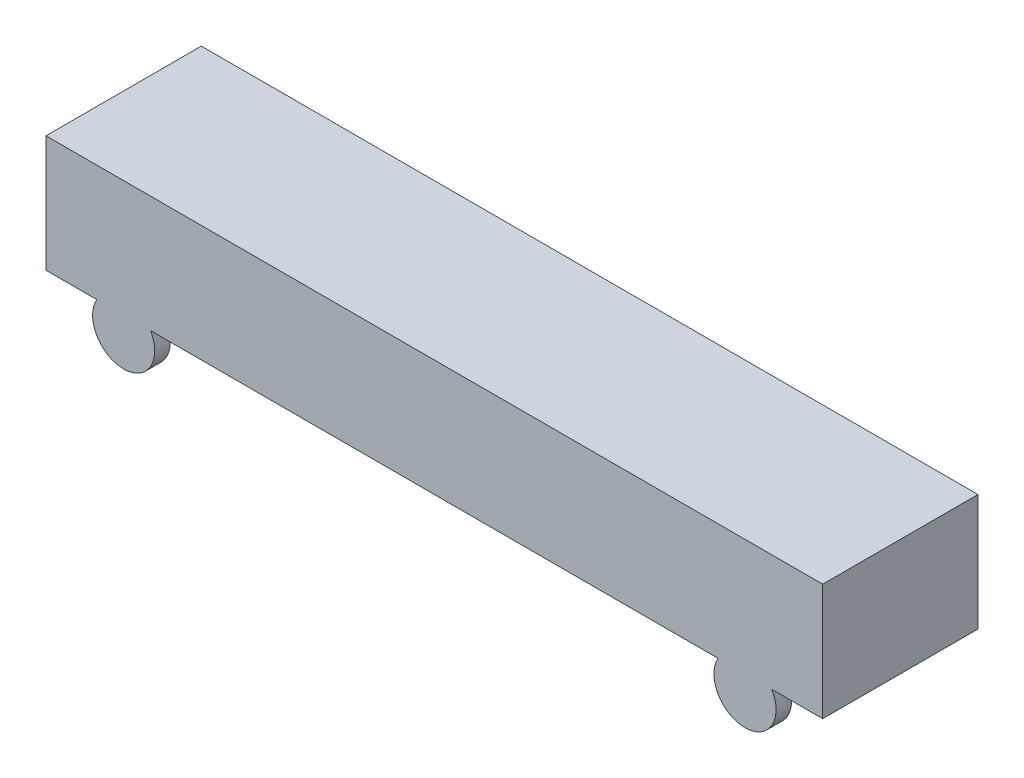
ISO-10303-21;
HEADER;
FILE_DESCRIPTION(('STEP AP214'),'2;1');
FILE_NAME('part.step','',(''),(''),'','','');
FILE_SCHEMA(('AUTOMOTIVE_DESIGN { 1 0 10303 214 1 1 1 1 }'));
ENDSEC;
DATA;
#1=APPLICATION_CONTEXT('core data for automotive mechanical design processes');
#2=APPLICATION_PROTOCOL_DEFINITION('international standard','automotive_design',2000,#1);
#3=PRODUCT_CONTEXT('',#1,'mechanical');
#4=PRODUCT('Part','Part','',(#3));
#5=PRODUCT_RELATED_PRODUCT_CATEGORY('part','',(#4));
#6=PRODUCT_DEFINITION_FORMATION('','',#4);
#7=PRODUCT_DEFINITION_CONTEXT('part definition',#1,'design');
#8=PRODUCT_DEFINITION('design','',#6,#7);
#9=PRODUCT_DEFINITION_SHAPE('','',#8);
#10=(LENGTH_UNIT() NAMED_UNIT(*) SI_UNIT(.MILLI.,.METRE.));
#11=(NAMED_UNIT(*) PLANE_ANGLE_UNIT() SI_UNIT($,.RADIAN.));
#12=(NAMED_UNIT(*) SI_UNIT($,.STERADIAN.) SOLID_ANGLE_UNIT());
#13=UNCERTAINTY_MEASURE_WITH_UNIT(LENGTH_MEASURE(1.E-05),#10,'distance_accuracy_value','');
#14=(GEOMETRIC_REPRESENTATION_CONTEXT(3) GLOBAL_UNCERTAINTY_ASSIGNED_CONTEXT((#13)) GLOBAL_UNIT_ASSIGNED_CONTEXT((#10,
#11,#12)) REPRESENTATION_CONTEXT('',''));
#15=CARTESIAN_POINT('',(0.,0.,0.));
#16=DIRECTION('',(0.,0.,1.));
#17=DIRECTION('',(1.,0.,0.));
#18=AXIS2_PLACEMENT_3D('',#15,#16,#17);
#19=CARTESIAN_POINT('',(0.,0.,-1.));
#20=DIRECTION('',(0.,-1.,0.));
#21=DIRECTION('',(0.,0.,-1.));
#22=AXIS2_PLACEMENT_3D('',#19,#20,#21);
#23=PLANE('',#22);
#24=DIRECTION('',(1.,0.,0.));
#25=VECTOR('',#24,1.);
#26=CARTESIAN_POINT('',(0.,0.,-1.));
#27=LINE('',#26,#25);
#28=CARTESIAN_POINT('',(0.,0.,-1.));
#29=VERTEX_POINT('',#28);
#30=CARTESIAN_POINT('',(0.653589838486258,0.,-1.));
#31=VERTEX_POINT('',#30);
#32=EDGE_CURVE('E135',#29,#31,#27,.T.);
#33=ORIENTED_EDGE('',*,*,#32,.T.);
#34=DIRECTION('',(0.,0.,-1.));
#35=VECTOR('',#34,1.);
#36=CARTESIAN_POINT('',(0.653589838486258,0.,-0.8));
#37=LINE('',#36,#35);
#38=CARTESIAN_POINT('',(0.653589838486258,0.,-0.8));
#39=VERTEX_POINT('',#38);
#40=EDGE_CURVE('E59',#31,#39,#37,.F.);
#41=ORIENTED_EDGE('',*,*,#40,.T.);
#42=DIRECTION('',(1.,0.,0.));
#43=VECTOR('',#42,1.);
#44=CARTESIAN_POINT('',(0.,0.,-0.8));
#45=LINE('',#44,#43);
#46=CARTESIAN_POINT('',(1.34641016151374,0.,-0.8));
#47=VERTEX_POINT('',#46);
#48=EDGE_CURVE('E11',#39,#47,#45,.T.);
#49=ORIENTED_EDGE('',*,*,#48,.T.);
#50=DIRECTION('',(0.,0.,-1.));
#51=VECTOR('',#50,1.);
#52=CARTESIAN_POINT('',(1.34641016151374,0.,-0.8));
#53=LINE('',#52,#51);
#54=CARTESIAN_POINT('',(1.34641016151374,0.,-1.));
#55=VERTEX_POINT('',#54);
#56=EDGE_CURVE('E138',#47,#55,#53,.T.);
#57=ORIENTED_EDGE('',*,*,#56,.T.);
#58=CARTESIAN_POINT('',(8.65358983848623,0.,-1.));
#59=VERTEX_POINT('',#58);
#60=EDGE_CURVE('E127',#55,#59,#27,.T.);
#61=ORIENTED_EDGE('',*,*,#60,.T.);
#62=DIRECTION('',(0.,0.,-1.));
#63=VECTOR('',#62,1.);
#64=CARTESIAN_POINT('',(8.65358983848623,0.,-0.8));
#65=LINE('',#64,#63);
#66=CARTESIAN_POINT('',(8.65358983848623,0.,-0.8));
#67=VERTEX_POINT('',#66);
#68=EDGE_CURVE('E156',#59,#67,#65,.F.);
#69=ORIENTED_EDGE('',*,*,#68,.T.);
#70=DIRECTION('',(1.,0.,0.));
#71=VECTOR('',#70,1.);
#72=CARTESIAN_POINT('',(0.,0.,-0.8));
#73=LINE('',#72,#71);
#74=CARTESIAN_POINT('',(9.34641016151378,0.,-0.8));
#75=VERTEX_POINT('',#74);
#76=EDGE_CURVE('E49',#67,#75,#73,.T.);
#77=ORIENTED_EDGE('',*,*,#76,.T.);
#78=DIRECTION('',(0.,0.,-1.));
#79=VECTOR('',#78,1.);
#80=CARTESIAN_POINT('',(9.34641016151378,0.,-0.8));
#81=LINE('',#80,#79);
#82=CARTESIAN_POINT('',(9.34641016151378,0.,-1.));
#83=VERTEX_POINT('',#82);
#84=EDGE_CURVE('E152',#75,#83,#81,.T.);
#85=ORIENTED_EDGE('',*,*,#84,.T.);
#86=CARTESIAN_POINT('',(10.,0.,-1.));
#87=VERTEX_POINT('',#86);
#88=EDGE_CURVE('E136',#83,#87,#27,.T.);
#89=ORIENTED_EDGE('',*,*,#88,.T.);
#90=DIRECTION('',(0.,0.,1.));
#91=VECTOR('',#90,1.);
#92=CARTESIAN_POINT('',(10.,0.,-1.));
#93=LINE('',#92,#91);
#94=CARTESIAN_POINT('',(10.,0.,1.));
#95=VERTEX_POINT('',#94);
#96=EDGE_CURVE('E207',#87,#95,#93,.T.);
#97=ORIENTED_EDGE('',*,*,#96,.T.);
#98=DIRECTION('',(1.,0.,0.));
#99=VECTOR('',#98,1.);
#100=CARTESIAN_POINT('',(0.,0.,1.));
#101=LINE('',#100,#99);
#102=CARTESIAN_POINT('',(9.34641016151378,0.,1.));
#103=VERTEX_POINT('',#102);
#104=EDGE_CURVE('E181',#103,#95,#101,.T.);
#105=ORIENTED_EDGE('',*,*,#104,.F.);
#106=DIRECTION('',(0.,0.,1.));
#107=VECTOR('',#106,1.);
#108=CARTESIAN_POINT('',(9.34641016151378,0.,0.8));
#109=LINE('',#108,#107);
#110=CARTESIAN_POINT('',(9.34641016151378,0.,0.8));
#111=VERTEX_POINT('',#110);
#112=EDGE_CURVE('E175',#111,#103,#109,.T.);
#113=ORIENTED_EDGE('',*,*,#112,.F.);
#114=DIRECTION('',(-1.,0.,0.));
#115=VECTOR('',#114,1.);
#116=CARTESIAN_POINT('',(0.,0.,0.8));
#117=LINE('',#116,#115);
#118=CARTESIAN_POINT('',(8.65358983848623,0.,0.8));
#119=VERTEX_POINT('',#118);
#120=EDGE_CURVE('E204',#111,#119,#117,.T.);
#121=ORIENTED_EDGE('',*,*,#120,.T.);
#122=DIRECTION('',(0.,0.,1.));
#123=VECTOR('',#122,1.);
#124=CARTESIAN_POINT('',(8.65358983848623,0.,0.8));
#125=LINE('',#124,#123);
#126=CARTESIAN_POINT('',(8.65358983848623,0.,1.));
#127=VERTEX_POINT('',#126);
#128=EDGE_CURVE('E172',#127,#119,#125,.F.);
#129=ORIENTED_EDGE('',*,*,#128,.F.);
#130=CARTESIAN_POINT('',(1.34641016151374,0.,1.));
#131=VERTEX_POINT('',#130);
#132=EDGE_CURVE('E186',#131,#127,#101,.T.);
#133=ORIENTED_EDGE('',*,*,#132,.F.);
#134=DIRECTION('',(0.,0.,1.));
#135=VECTOR('',#134,1.);
#136=CARTESIAN_POINT('',(1.34641016151374,0.,0.8));
#137=LINE('',#136,#135);
#138=CARTESIAN_POINT('',(1.34641016151374,0.,0.8));
#139=VERTEX_POINT('',#138);
#140=EDGE_CURVE('E165',#139,#131,#137,.T.);
#141=ORIENTED_EDGE('',*,*,#140,.F.);
#142=DIRECTION('',(-1.,0.,0.));
#143=VECTOR('',#142,1.);
#144=CARTESIAN_POINT('',(0.,0.,0.8));
#145=LINE('',#144,#143);
#146=CARTESIAN_POINT('',(0.653589838486258,0.,0.8));
#147=VERTEX_POINT('',#146);
#148=EDGE_CURVE('E213',#139,#147,#145,.T.);
#149=ORIENTED_EDGE('',*,*,#148,.T.);
#150=DIRECTION('',(0.,0.,1.));
#151=VECTOR('',#150,1.);
#152=CARTESIAN_POINT('',(0.653589838486258,0.,0.8));
#153=LINE('',#152,#151);
#154=CARTESIAN_POINT('',(0.653589838486258,0.,1.));
#155=VERTEX_POINT('',#154);
#156=EDGE_CURVE('E161',#155,#147,#153,.F.);
#157=ORIENTED_EDGE('',*,*,#156,.F.);
#158=CARTESIAN_POINT('',(0.,0.,1.));
#159=VERTEX_POINT('',#158);
#160=EDGE_CURVE('E182',#159,#155,#101,.T.);
#161=ORIENTED_EDGE('',*,*,#160,.F.);
#162=DIRECTION('',(0.,0.,1.));
#163=VECTOR('',#162,1.);
#164=CARTESIAN_POINT('',(0.,0.,-1.));
#165=LINE('',#164,#163);
#166=EDGE_CURVE('E201',#29,#159,#165,.T.);
#167=ORIENTED_EDGE('',*,*,#166,.F.);
#168=EDGE_LOOP('',(#33,#41,#49,#57,#61,#69,#77,#85,#89,#97,#105,#113,#121,#129,#133,#141,#149,
#157,#161,#167));
#169=FACE_BOUND('',#168,.T.);
#170=ADVANCED_FACE('F41',(#169),#23,.T.);
#171=CARTESIAN_POINT('',(0.,0.,-1.));
#172=DIRECTION('',(-1.,0.,0.));
#173=DIRECTION('',(0.,0.,1.));
#174=AXIS2_PLACEMENT_3D('',#171,#172,#173);
#175=PLANE('',#174);
#176=ORIENTED_EDGE('',*,*,#166,.T.);
#177=DIRECTION('',(0.,-1.,0.));
#178=VECTOR('',#177,1.);
#179=CARTESIAN_POINT('',(0.,0.,1.));
#180=LINE('',#179,#178);
#181=CARTESIAN_POINT('',(0.,1.5,1.));
#182=VERTEX_POINT('',#181);
#183=EDGE_CURVE('E178',#182,#159,#180,.T.);
#184=ORIENTED_EDGE('',*,*,#183,.F.);
#185=DIRECTION('',(0.,0.,1.));
#186=VECTOR('',#185,1.);
#187=CARTESIAN_POINT('',(0.,1.5,-1.));
#188=LINE('',#187,#186);
#189=CARTESIAN_POINT('',(0.,1.5,-1.));
#190=VERTEX_POINT('',#189);
#191=EDGE_CURVE('E202',#190,#182,#188,.T.);
#192=ORIENTED_EDGE('',*,*,#191,.F.);
#193=DIRECTION('',(0.,-1.,0.));
#194=VECTOR('',#193,1.);
#195=CARTESIAN_POINT('',(0.,0.,-1.));
#196=LINE('',#195,#194);
#197=EDGE_CURVE('E192',#190,#29,#196,.T.);
#198=ORIENTED_EDGE('',*,*,#197,.T.);
#199=EDGE_LOOP('',(#176,#184,#192,#198));
#200=FACE_BOUND('',#199,.T.);
#201=ADVANCED_FACE('F43',(#200),#175,.T.);
#202=CARTESIAN_POINT('',(0.,1.5,-1.));
#203=DIRECTION('',(0.,1.,0.));
#204=DIRECTION('',(0.,0.,1.));
#205=AXIS2_PLACEMENT_3D('',#202,#203,#204);
#206=PLANE('',#205);
#207=ORIENTED_EDGE('',*,*,#191,.T.);
#208=DIRECTION('',(-1.,0.,0.));
#209=VECTOR('',#208,1.);
#210=CARTESIAN_POINT('',(0.,1.5,1.));
#211=LINE('',#210,#209);
#212=CARTESIAN_POINT('',(10.,1.5,1.));
#213=VERTEX_POINT('',#212);
#214=EDGE_CURVE('E189',#213,#182,#211,.T.);
#215=ORIENTED_EDGE('',*,*,#214,.F.);
#216=DIRECTION('',(0.,0.,1.));
#217=VECTOR('',#216,1.);
#218=CARTESIAN_POINT('',(10.,1.5,-1.));
#219=LINE('',#218,#217);
#220=CARTESIAN_POINT('',(10.,1.5,-1.));
#221=VERTEX_POINT('',#220);
#222=EDGE_CURVE('E205',#221,#213,#219,.T.);
#223=ORIENTED_EDGE('',*,*,#222,.F.);
#224=DIRECTION('',(-1.,0.,0.));
#225=VECTOR('',#224,1.);
#226=CARTESIAN_POINT('',(0.,1.5,-1.));
#227=LINE('',#226,#225);
#228=EDGE_CURVE('E198',#221,#190,#227,.T.);
#229=ORIENTED_EDGE('',*,*,#228,.T.);
#230=EDGE_LOOP('',(#207,#215,#223,#229));
#231=FACE_BOUND('',#230,.T.);
#232=ADVANCED_FACE('F236',(#231),#206,.T.);
#233=CARTESIAN_POINT('',(10.,0.,-1.));
#234=DIRECTION('',(1.,0.,0.));
#235=DIRECTION('',(0.,0.,-1.));
#236=AXIS2_PLACEMENT_3D('',#233,#234,#235);
#237=PLANE('',#236);
#238=ORIENTED_EDGE('',*,*,#222,.T.);
#239=DIRECTION('',(0.,1.,0.));
#240=VECTOR('',#239,1.);
#241=CARTESIAN_POINT('',(10.,0.,1.));
#242=LINE('',#241,#240);
#243=EDGE_CURVE('E185',#95,#213,#242,.T.);
#244=ORIENTED_EDGE('',*,*,#243,.F.);
#245=ORIENTED_EDGE('',*,*,#96,.F.);
#246=DIRECTION('',(0.,1.,0.));
#247=VECTOR('',#246,1.);
#248=CARTESIAN_POINT('',(10.,0.,-1.));
#249=LINE('',#248,#247);
#250=EDGE_CURVE('E195',#87,#221,#249,.T.);
#251=ORIENTED_EDGE('',*,*,#250,.T.);
#252=EDGE_LOOP('',(#238,#244,#245,#251));
#253=FACE_BOUND('',#252,.T.);
#254=ADVANCED_FACE('F239',(#253),#237,.T.);
#255=CARTESIAN_POINT('',(0.,0.,-1.));
#256=DIRECTION('',(0.,0.,-1.));
#257=DIRECTION('',(-1.,0.,0.));
#258=AXIS2_PLACEMENT_3D('',#255,#256,#257);
#259=PLANE('',#258);
#260=ORIENTED_EDGE('',*,*,#60,.F.);
#261=CARTESIAN_POINT('',(1.,-0.200000000000056,-1.));
#262=DIRECTION('',(0.,0.,1.));
#263=DIRECTION('',(1.,0.,0.));
#264=AXIS2_PLACEMENT_3D('',#261,#262,#263);
#265=CIRCLE('',#264,0.4);
#266=EDGE_CURVE('E131',#31,#55,#265,.T.);
#267=ORIENTED_EDGE('',*,*,#266,.F.);
#268=ORIENTED_EDGE('',*,*,#32,.F.);
#269=ORIENTED_EDGE('',*,*,#197,.F.);
#270=ORIENTED_EDGE('',*,*,#228,.F.);
#271=ORIENTED_EDGE('',*,*,#250,.F.);
#272=ORIENTED_EDGE('',*,*,#88,.F.);
#273=CARTESIAN_POINT('',(9.,-0.2,-1.));
#274=DIRECTION('',(0.,0.,1.));
#275=DIRECTION('',(1.,0.,0.));
#276=AXIS2_PLACEMENT_3D('',#273,#274,#275);
#277=CIRCLE('',#276,0.4);
#278=EDGE_CURVE('E133',#59,#83,#277,.T.);
#279=ORIENTED_EDGE('',*,*,#278,.F.);
#280=EDGE_LOOP('',(#260,#267,#268,#269,#270,#271,#272,#279));
#281=FACE_BOUND('',#280,.T.);
#282=ADVANCED_FACE('F128',(#281),#259,.T.);
#283=CARTESIAN_POINT('',(0.,0.,1.));
#284=DIRECTION('',(0.,0.,-1.));
#285=DIRECTION('',(-1.,0.,0.));
#286=AXIS2_PLACEMENT_3D('',#283,#284,#285);
#287=PLANE('',#286);
#288=ORIENTED_EDGE('',*,*,#160,.T.);
#289=CARTESIAN_POINT('',(1.,-0.200000000000056,1.));
#290=DIRECTION('',(0.,0.,1.));
#291=DIRECTION('',(1.,0.,0.));
#292=AXIS2_PLACEMENT_3D('',#289,#290,#291);
#293=CIRCLE('',#292,0.4);
#294=EDGE_CURVE('E159',#155,#131,#293,.T.);
#295=ORIENTED_EDGE('',*,*,#294,.T.);
#296=ORIENTED_EDGE('',*,*,#132,.T.);
#297=CARTESIAN_POINT('',(9.,-0.2,1.));
#298=DIRECTION('',(0.,0.,1.));
#299=DIRECTION('',(1.,0.,0.));
#300=AXIS2_PLACEMENT_3D('',#297,#298,#299);
#301=CIRCLE('',#300,0.4);
#302=EDGE_CURVE('E168',#127,#103,#301,.T.);
#303=ORIENTED_EDGE('',*,*,#302,.T.);
#304=ORIENTED_EDGE('',*,*,#104,.T.);
#305=ORIENTED_EDGE('',*,*,#243,.T.);
#306=ORIENTED_EDGE('',*,*,#214,.T.);
#307=ORIENTED_EDGE('',*,*,#183,.T.);
#308=EDGE_LOOP('',(#288,#295,#296,#303,#304,#305,#306,#307));
#309=FACE_BOUND('',#308,.T.);
#310=ADVANCED_FACE('F248',(#309),#287,.F.);
#311=CARTESIAN_POINT('',(9.,-0.2,0.8));
#312=DIRECTION('',(0.,0.,1.));
#313=DIRECTION('',(1.,0.,0.));
#314=AXIS2_PLACEMENT_3D('',#311,#312,#313);
#315=CYLINDRICAL_SURFACE('',#314,0.4);
#316=CARTESIAN_POINT('',(9.,-0.2,0.8));
#317=DIRECTION('',(0.,0.,1.));
#318=DIRECTION('',(1.,0.,0.));
#319=AXIS2_PLACEMENT_3D('',#316,#317,#318);
#320=CIRCLE('',#319,0.4);
#321=EDGE_CURVE('E169',#119,#111,#320,.T.);
#322=ORIENTED_EDGE('',*,*,#321,.T.);
#323=ORIENTED_EDGE('',*,*,#112,.T.);
#324=ORIENTED_EDGE('',*,*,#302,.F.);
#325=ORIENTED_EDGE('',*,*,#128,.T.);
#326=EDGE_LOOP('',(#322,#323,#324,#325));
#327=FACE_BOUND('',#326,.T.);
#328=ADVANCED_FACE('F251',(#327),#315,.T.);
#329=CARTESIAN_POINT('',(9.,-0.2,0.8));
#330=DIRECTION('',(0.,0.,1.));
#331=DIRECTION('',(1.,0.,0.));
#332=AXIS2_PLACEMENT_3D('',#329,#330,#331);
#333=PLANE('',#332);
#334=ORIENTED_EDGE('',*,*,#120,.F.);
#335=ORIENTED_EDGE('',*,*,#321,.F.);
#336=EDGE_LOOP('',(#334,#335));
#337=FACE_BOUND('',#336,.T.);
#338=ADVANCED_FACE('F255',(#337),#333,.F.);
#339=CARTESIAN_POINT('',(1.,-0.200000000000056,0.8));
#340=DIRECTION('',(0.,0.,1.));
#341=DIRECTION('',(1.,0.,0.));
#342=AXIS2_PLACEMENT_3D('',#339,#340,#341);
#343=CYLINDRICAL_SURFACE('',#342,0.4);
#344=CARTESIAN_POINT('',(1.,-0.200000000000056,0.8));
#345=DIRECTION('',(0.,0.,1.));
#346=DIRECTION('',(1.,0.,0.));
#347=AXIS2_PLACEMENT_3D('',#344,#345,#346);
#348=CIRCLE('',#347,0.4);
#349=EDGE_CURVE('E158',#147,#139,#348,.T.);
#350=ORIENTED_EDGE('',*,*,#349,.T.);
#351=ORIENTED_EDGE('',*,*,#140,.T.);
#352=ORIENTED_EDGE('',*,*,#294,.F.);
#353=ORIENTED_EDGE('',*,*,#156,.T.);
#354=EDGE_LOOP('',(#350,#351,#352,#353));
#355=FACE_BOUND('',#354,.T.);
#356=ADVANCED_FACE('F259',(#355),#343,.T.);
#357=CARTESIAN_POINT('',(1.,-0.200000000000056,0.8));
#358=DIRECTION('',(0.,0.,1.));
#359=DIRECTION('',(1.,0.,0.));
#360=AXIS2_PLACEMENT_3D('',#357,#358,#359);
#361=PLANE('',#360);
#362=ORIENTED_EDGE('',*,*,#148,.F.);
#363=ORIENTED_EDGE('',*,*,#349,.F.);
#364=EDGE_LOOP('',(#362,#363));
#365=FACE_BOUND('',#364,.T.);
#366=ADVANCED_FACE('F230',(#365),#361,.F.);
#367=CARTESIAN_POINT('',(9.,-0.2,-0.8));
#368=DIRECTION('',(0.,0.,-1.));
#369=DIRECTION('',(-1.,0.,0.));
#370=AXIS2_PLACEMENT_3D('',#367,#368,#369);
#371=CYLINDRICAL_SURFACE('',#370,0.4);
#372=ORIENTED_EDGE('',*,*,#68,.F.);
#373=ORIENTED_EDGE('',*,*,#278,.T.);
#374=ORIENTED_EDGE('',*,*,#84,.F.);
#375=CARTESIAN_POINT('',(9.,-0.2,-0.8));
#376=DIRECTION('',(0.,0.,1.));
#377=DIRECTION('',(1.,0.,0.));
#378=AXIS2_PLACEMENT_3D('',#375,#376,#377);
#379=CIRCLE('',#378,0.4);
#380=EDGE_CURVE('E149',#67,#75,#379,.T.);
#381=ORIENTED_EDGE('',*,*,#380,.F.);
#382=EDGE_LOOP('',(#372,#373,#374,#381));
#383=FACE_BOUND('',#382,.T.);
#384=ADVANCED_FACE('F220',(#383),#371,.T.);
#385=CARTESIAN_POINT('',(9.,-0.2,-0.8));
#386=DIRECTION('',(0.,0.,-1.));
#387=DIRECTION('',(1.,0.,0.));
#388=AXIS2_PLACEMENT_3D('',#385,#386,#387);
#389=PLANE('',#388);
#390=ORIENTED_EDGE('',*,*,#76,.F.);
#391=ORIENTED_EDGE('',*,*,#380,.T.);
#392=EDGE_LOOP('',(#390,#391));
#393=FACE_BOUND('',#392,.T.);
#394=ADVANCED_FACE('F221',(#393),#389,.F.);
#395=CARTESIAN_POINT('',(1.,-0.200000000000056,-0.8));
#396=DIRECTION('',(0.,0.,-1.));
#397=DIRECTION('',(-1.,0.,0.));
#398=AXIS2_PLACEMENT_3D('',#395,#396,#397);
#399=CYLINDRICAL_SURFACE('',#398,0.4);
#400=ORIENTED_EDGE('',*,*,#40,.F.);
#401=ORIENTED_EDGE('',*,*,#266,.T.);
#402=ORIENTED_EDGE('',*,*,#56,.F.);
#403=CARTESIAN_POINT('',(1.,-0.200000000000056,-0.8));
#404=DIRECTION('',(0.,0.,1.));
#405=DIRECTION('',(1.,0.,0.));
#406=AXIS2_PLACEMENT_3D('',#403,#404,#405);
#407=CIRCLE('',#406,0.4);
#408=EDGE_CURVE('E142',#39,#47,#407,.T.);
#409=ORIENTED_EDGE('',*,*,#408,.F.);
#410=EDGE_LOOP('',(#400,#401,#402,#409));
#411=FACE_BOUND('',#410,.T.);
#412=ADVANCED_FACE('F144',(#411),#399,.T.);
#413=CARTESIAN_POINT('',(1.,-0.200000000000056,-0.8));
#414=DIRECTION('',(0.,0.,-1.));
#415=DIRECTION('',(1.,0.,0.));
#416=AXIS2_PLACEMENT_3D('',#413,#414,#415);
#417=PLANE('',#416);
#418=ORIENTED_EDGE('',*,*,#48,.F.);
#419=ORIENTED_EDGE('',*,*,#408,.T.);
#420=EDGE_LOOP('',(#418,#419));
#421=FACE_BOUND('',#420,.T.);
#422=ADVANCED_FACE('F228',(#421),#417,.F.);
#423=CLOSED_SHELL('',(#170,#201,#232,#254,#282,#310,#328,#338,#356,#366,#384,#394,#412,#422));
#424=MANIFOLD_SOLID_BREP('B2',#423);
#425=ADVANCED_BREP_SHAPE_REPRESENTATION('',(#18,#424),#14);
#426=SHAPE_DEFINITION_REPRESENTATION(#9,#425);
ENDSEC;
END-ISO-10303-21;
